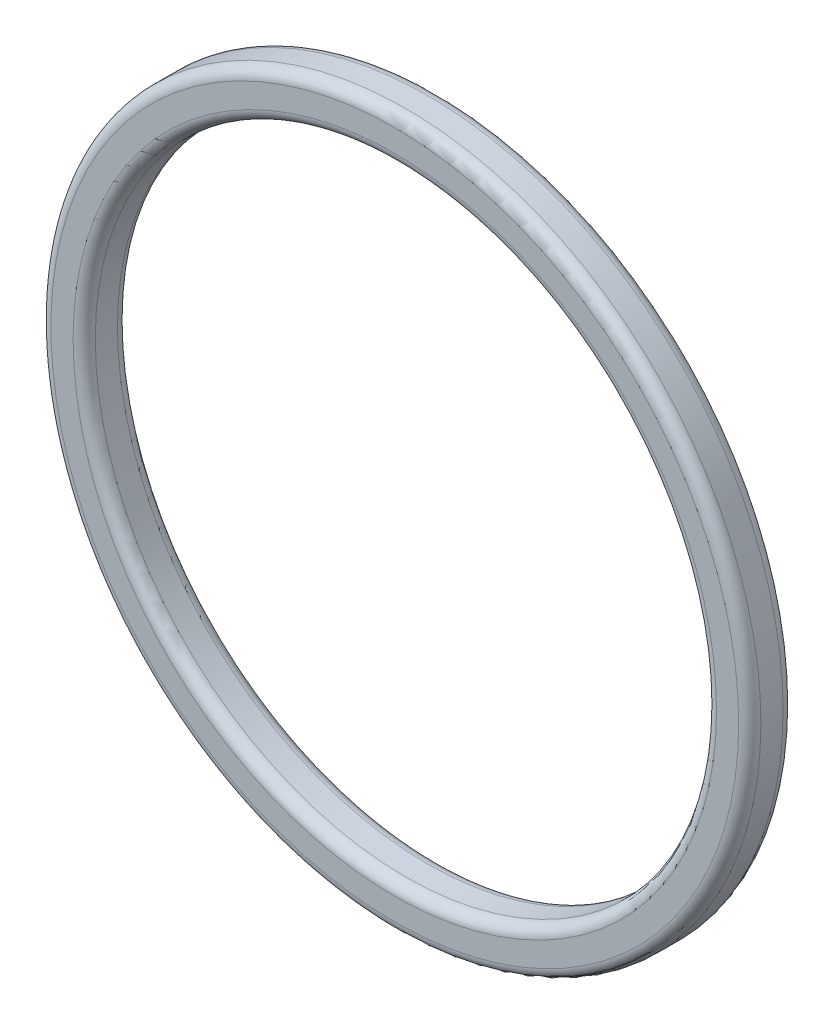
ISO-10303-21;
HEADER;
FILE_DESCRIPTION(('STEP AP214'),'2;1');
FILE_NAME('part.step','',(''),(''),'','','');
FILE_SCHEMA(('AUTOMOTIVE_DESIGN { 1 0 10303 214 1 1 1 1 }'));
ENDSEC;
DATA;
#1=APPLICATION_CONTEXT('core data for automotive mechanical design processes');
#2=APPLICATION_PROTOCOL_DEFINITION('international standard','automotive_design',2000,#1);
#3=PRODUCT_CONTEXT('',#1,'mechanical');
#4=PRODUCT('Part','Part','',(#3));
#5=PRODUCT_RELATED_PRODUCT_CATEGORY('part','',(#4));
#6=PRODUCT_DEFINITION_FORMATION('','',#4);
#7=PRODUCT_DEFINITION_CONTEXT('part definition',#1,'design');
#8=PRODUCT_DEFINITION('design','',#6,#7);
#9=PRODUCT_DEFINITION_SHAPE('','',#8);
#10=(LENGTH_UNIT() NAMED_UNIT(*) SI_UNIT(.MILLI.,.METRE.));
#11=(NAMED_UNIT(*) PLANE_ANGLE_UNIT() SI_UNIT($,.RADIAN.));
#12=(NAMED_UNIT(*) SI_UNIT($,.STERADIAN.) SOLID_ANGLE_UNIT());
#13=UNCERTAINTY_MEASURE_WITH_UNIT(LENGTH_MEASURE(1.E-05),#10,'distance_accuracy_value','');
#14=(GEOMETRIC_REPRESENTATION_CONTEXT(3) GLOBAL_UNCERTAINTY_ASSIGNED_CONTEXT((#13)) GLOBAL_UNIT_ASSIGNED_CONTEXT((#10,
#11,#12)) REPRESENTATION_CONTEXT('',''));
#15=CARTESIAN_POINT('',(0.,0.,0.));
#16=DIRECTION('',(0.,0.,1.));
#17=DIRECTION('',(1.,0.,0.));
#18=AXIS2_PLACEMENT_3D('',#15,#16,#17);
#19=CARTESIAN_POINT('',(0.,0.,1.));
#20=DIRECTION('',(0.,0.,1.));
#21=DIRECTION('',(1.,0.,0.));
#22=AXIS2_PLACEMENT_3D('',#19,#20,#21);
#23=PLANE('',#22);
#24=CARTESIAN_POINT('',(0.,0.,1.));
#25=DIRECTION('',(0.,0.,1.));
#26=DIRECTION('',(1.,0.,0.));
#27=AXIS2_PLACEMENT_3D('',#24,#25,#26);
#28=CIRCLE('',#27,7.25);
#29=CARTESIAN_POINT('',(7.25,0.,1.));
#30=VERTEX_POINT('',#29);
#31=EDGE_CURVE('E61',#30,#30,#28,.F.);
#32=ORIENTED_EDGE('',*,*,#31,.T.);
#33=EDGE_LOOP('',(#32));
#34=FACE_BOUND('',#33,.T.);
#35=CARTESIAN_POINT('',(0.,0.,1.));
#36=DIRECTION('',(0.,0.,1.));
#37=DIRECTION('',(1.,0.,0.));
#38=AXIS2_PLACEMENT_3D('',#35,#36,#37);
#39=CIRCLE('',#38,7.75000000000001);
#40=CARTESIAN_POINT('',(7.75000000000001,0.,1.));
#41=VERTEX_POINT('',#40);
#42=EDGE_CURVE('E73',#41,#41,#39,.T.);
#43=ORIENTED_EDGE('',*,*,#42,.T.);
#44=EDGE_LOOP('',(#43));
#45=FACE_BOUND('',#44,.T.);
#46=ADVANCED_FACE('F37',(#34,#45),#23,.T.);
#47=CARTESIAN_POINT('',(0.,0.,0.));
#48=DIRECTION('',(0.,0.,1.));
#49=DIRECTION('',(1.,0.,0.));
#50=AXIS2_PLACEMENT_3D('',#47,#48,#49);
#51=PLANE('',#50);
#52=CARTESIAN_POINT('',(0.,0.,0.));
#53=DIRECTION('',(0.,0.,1.));
#54=DIRECTION('',(1.,0.,0.));
#55=AXIS2_PLACEMENT_3D('',#52,#53,#54);
#56=CIRCLE('',#55,7.25);
#57=CARTESIAN_POINT('',(7.25,0.,0.));
#58=VERTEX_POINT('',#57);
#59=EDGE_CURVE('E45',#58,#58,#56,.T.);
#60=ORIENTED_EDGE('',*,*,#59,.T.);
#61=EDGE_LOOP('',(#60));
#62=FACE_BOUND('',#61,.T.);
#63=CARTESIAN_POINT('',(0.,0.,0.));
#64=DIRECTION('',(0.,0.,1.));
#65=DIRECTION('',(1.,0.,0.));
#66=AXIS2_PLACEMENT_3D('',#63,#64,#65);
#67=CIRCLE('',#66,7.75000000000001);
#68=CARTESIAN_POINT('',(7.75000000000001,0.,0.));
#69=VERTEX_POINT('',#68);
#70=EDGE_CURVE('E50',#69,#69,#67,.F.);
#71=ORIENTED_EDGE('',*,*,#70,.T.);
#72=EDGE_LOOP('',(#71));
#73=FACE_BOUND('',#72,.T.);
#74=ADVANCED_FACE('F97',(#62,#73),#51,.F.);
#75=CARTESIAN_POINT('',(0.,0.,1.));
#76=DIRECTION('',(0.,0.,-1.));
#77=DIRECTION('',(-1.,0.,0.));
#78=AXIS2_PLACEMENT_3D('',#75,#76,#77);
#79=CYLINDRICAL_SURFACE('',#78,8.00000000000001);
#80=CARTESIAN_POINT('',(0.,0.,0.25));
#81=DIRECTION('',(0.,0.,1.));
#82=DIRECTION('',(1.,0.,0.));
#83=AXIS2_PLACEMENT_3D('',#80,#81,#82);
#84=CIRCLE('',#83,8.00000000000001);
#85=CARTESIAN_POINT('',(8.00000000000001,0.,0.25));
#86=VERTEX_POINT('',#85);
#87=EDGE_CURVE('E55',#86,#86,#84,.T.);
#88=ORIENTED_EDGE('',*,*,#87,.T.);
#89=EDGE_LOOP('',(#88));
#90=FACE_BOUND('',#89,.T.);
#91=CARTESIAN_POINT('',(0.,0.,0.75));
#92=DIRECTION('',(0.,0.,1.));
#93=DIRECTION('',(1.,0.,0.));
#94=AXIS2_PLACEMENT_3D('',#91,#92,#93);
#95=CIRCLE('',#94,8.00000000000001);
#96=CARTESIAN_POINT('',(8.00000000000001,0.,0.75));
#97=VERTEX_POINT('',#96);
#98=EDGE_CURVE('E69',#97,#97,#95,.F.);
#99=ORIENTED_EDGE('',*,*,#98,.T.);
#100=EDGE_LOOP('',(#99));
#101=FACE_BOUND('',#100,.T.);
#102=ADVANCED_FACE('F92',(#90,#101),#79,.T.);
#103=CARTESIAN_POINT('',(0.,0.,1.));
#104=DIRECTION('',(0.,0.,-1.));
#105=DIRECTION('',(-1.,0.,0.));
#106=AXIS2_PLACEMENT_3D('',#103,#104,#105);
#107=CYLINDRICAL_SURFACE('',#106,7.);
#108=CARTESIAN_POINT('',(0.,0.,0.25));
#109=DIRECTION('',(0.,0.,1.));
#110=DIRECTION('',(1.,0.,0.));
#111=AXIS2_PLACEMENT_3D('',#108,#109,#110);
#112=CIRCLE('',#111,7.);
#113=CARTESIAN_POINT('',(7.,0.,0.25));
#114=VERTEX_POINT('',#113);
#115=EDGE_CURVE('E10',#114,#114,#112,.F.);
#116=ORIENTED_EDGE('',*,*,#115,.T.);
#117=EDGE_LOOP('',(#116));
#118=FACE_BOUND('',#117,.T.);
#119=CARTESIAN_POINT('',(0.,0.,0.75));
#120=DIRECTION('',(0.,0.,1.));
#121=DIRECTION('',(1.,0.,0.));
#122=AXIS2_PLACEMENT_3D('',#119,#120,#121);
#123=CIRCLE('',#122,7.);
#124=CARTESIAN_POINT('',(7.,0.,0.75));
#125=VERTEX_POINT('',#124);
#126=EDGE_CURVE('E65',#125,#125,#123,.T.);
#127=ORIENTED_EDGE('',*,*,#126,.T.);
#128=EDGE_LOOP('',(#127));
#129=FACE_BOUND('',#128,.T.);
#130=ADVANCED_FACE('F82',(#118,#129),#107,.F.);
#131=CARTESIAN_POINT('',(0.,0.,0.75));
#132=DIRECTION('',(0.,0.,1.));
#133=DIRECTION('',(1.,0.,0.));
#134=AXIS2_PLACEMENT_3D('',#131,#132,#133);
#135=TOROIDAL_SURFACE('',#134,7.75000000000001,0.25);
#136=ORIENTED_EDGE('',*,*,#98,.F.);
#137=EDGE_LOOP('',(#136));
#138=FACE_BOUND('',#137,.T.);
#139=ORIENTED_EDGE('',*,*,#42,.F.);
#140=EDGE_LOOP('',(#139));
#141=FACE_BOUND('',#140,.T.);
#142=ADVANCED_FACE('F79',(#138,#141),#135,.T.);
#143=CARTESIAN_POINT('',(0.,0.,0.75));
#144=DIRECTION('',(0.,0.,1.));
#145=DIRECTION('',(1.,0.,0.));
#146=AXIS2_PLACEMENT_3D('',#143,#144,#145);
#147=TOROIDAL_SURFACE('',#146,7.25,0.25);
#148=ORIENTED_EDGE('',*,*,#31,.F.);
#149=EDGE_LOOP('',(#148));
#150=FACE_BOUND('',#149,.T.);
#151=ORIENTED_EDGE('',*,*,#126,.F.);
#152=EDGE_LOOP('',(#151));
#153=FACE_BOUND('',#152,.T.);
#154=ADVANCED_FACE('F81',(#150,#153),#147,.T.);
#155=CARTESIAN_POINT('',(0.,0.,0.25));
#156=DIRECTION('',(0.,0.,1.));
#157=DIRECTION('',(1.,0.,0.));
#158=AXIS2_PLACEMENT_3D('',#155,#156,#157);
#159=TOROIDAL_SURFACE('',#158,7.75000000000001,0.25);
#160=ORIENTED_EDGE('',*,*,#70,.F.);
#161=EDGE_LOOP('',(#160));
#162=FACE_BOUND('',#161,.T.);
#163=ORIENTED_EDGE('',*,*,#87,.F.);
#164=EDGE_LOOP('',(#163));
#165=FACE_BOUND('',#164,.T.);
#166=ADVANCED_FACE('F89',(#162,#165),#159,.T.);
#167=CARTESIAN_POINT('',(0.,0.,0.25));
#168=DIRECTION('',(0.,0.,1.));
#169=DIRECTION('',(1.,0.,0.));
#170=AXIS2_PLACEMENT_3D('',#167,#168,#169);
#171=TOROIDAL_SURFACE('',#170,7.25,0.25);
#172=ORIENTED_EDGE('',*,*,#115,.F.);
#173=EDGE_LOOP('',(#172));
#174=FACE_BOUND('',#173,.T.);
#175=ORIENTED_EDGE('',*,*,#59,.F.);
#176=EDGE_LOOP('',(#175));
#177=FACE_BOUND('',#176,.T.);
#178=ADVANCED_FACE('F39',(#174,#177),#171,.T.);
#179=CLOSED_SHELL('',(#46,#74,#102,#130,#142,#154,#166,#178));
#180=MANIFOLD_SOLID_BREP('B2',#179);
#181=ADVANCED_BREP_SHAPE_REPRESENTATION('',(#18,#180),#14);
#182=SHAPE_DEFINITION_REPRESENTATION(#9,#181);
ENDSEC;
END-ISO-10303-21;
